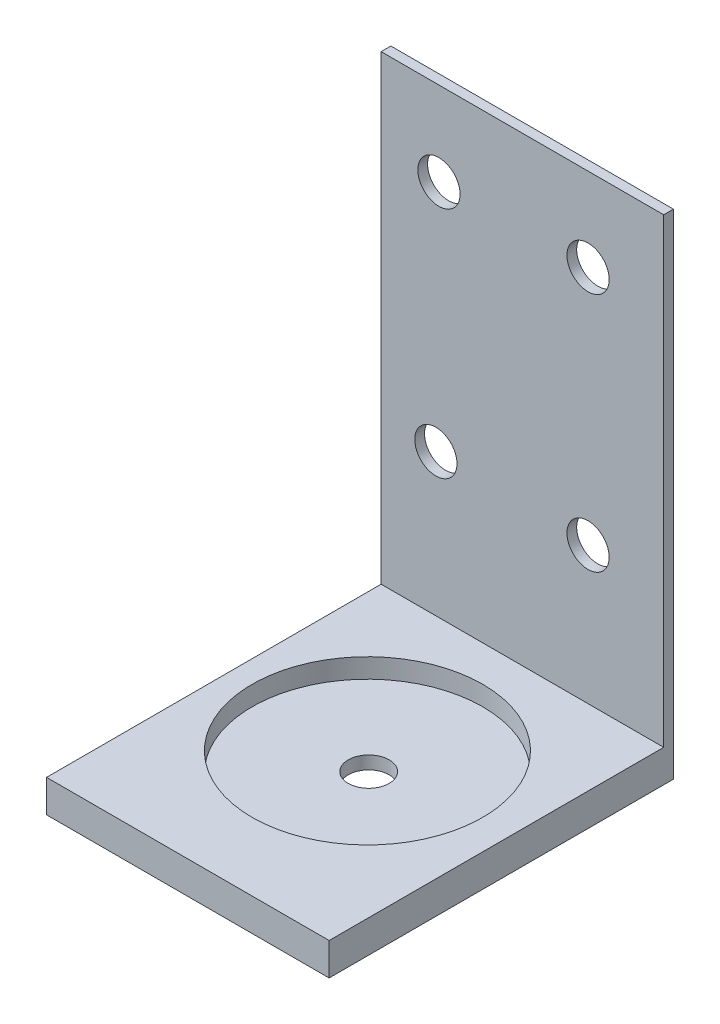
ISO-10303-21;
HEADER;
FILE_DESCRIPTION(('STEP AP214'),'2;1');
FILE_NAME('part.step','',(''),(''),'','','');
FILE_SCHEMA(('AUTOMOTIVE_DESIGN { 1 0 10303 214 1 1 1 1 }'));
ENDSEC;
DATA;
#1=APPLICATION_CONTEXT('core data for automotive mechanical design processes');
#2=APPLICATION_PROTOCOL_DEFINITION('international standard','automotive_design',2000,#1);
#3=PRODUCT_CONTEXT('',#1,'mechanical');
#4=PRODUCT('Part','Part','',(#3));
#5=PRODUCT_RELATED_PRODUCT_CATEGORY('part','',(#4));
#6=PRODUCT_DEFINITION_FORMATION('','',#4);
#7=PRODUCT_DEFINITION_CONTEXT('part definition',#1,'design');
#8=PRODUCT_DEFINITION('design','',#6,#7);
#9=PRODUCT_DEFINITION_SHAPE('','',#8);
#10=(LENGTH_UNIT() NAMED_UNIT(*) SI_UNIT(.MILLI.,.METRE.));
#11=(NAMED_UNIT(*) PLANE_ANGLE_UNIT() SI_UNIT($,.RADIAN.));
#12=(NAMED_UNIT(*) SI_UNIT($,.STERADIAN.) SOLID_ANGLE_UNIT());
#13=UNCERTAINTY_MEASURE_WITH_UNIT(LENGTH_MEASURE(1.E-05),#10,'distance_accuracy_value','');
#14=(GEOMETRIC_REPRESENTATION_CONTEXT(3) GLOBAL_UNCERTAINTY_ASSIGNED_CONTEXT((#13)) GLOBAL_UNIT_ASSIGNED_CONTEXT((#10,
#11,#12)) REPRESENTATION_CONTEXT('',''));
#15=CARTESIAN_POINT('',(0.,0.,0.));
#16=DIRECTION('',(0.,0.,1.));
#17=DIRECTION('',(1.,0.,0.));
#18=AXIS2_PLACEMENT_3D('',#15,#16,#17);
#19=CARTESIAN_POINT('',(0.,2.54,0.));
#20=DIRECTION('',(0.,-1.,0.));
#21=DIRECTION('',(0.,0.,-1.));
#22=AXIS2_PLACEMENT_3D('',#19,#20,#21);
#23=PLANE('',#22);
#24=CARTESIAN_POINT('',(-1.94128650310432,2.54,-7.50030305193306));
#25=DIRECTION('',(0.,1.,0.));
#26=DIRECTION('',(0.,0.,1.));
#27=AXIS2_PLACEMENT_3D('',#24,#25,#26);
#28=CIRCLE('',#27,9.017);
#29=CARTESIAN_POINT('',(-1.94128650310432,2.54,1.51669694806694));
#30=VERTEX_POINT('',#29);
#31=EDGE_CURVE('E329',#30,#30,#28,.T.);
#32=ORIENTED_EDGE('',*,*,#31,.F.);
#33=EDGE_LOOP('',(#32));
#34=FACE_BOUND('',#33,.T.);
#35=DIRECTION('',(1.,0.,0.));
#36=VECTOR('',#35,1.);
#37=CARTESIAN_POINT('',(-12.6914189189189,2.54,-19.3203040540541));
#38=LINE('',#37,#36);
#39=CARTESIAN_POINT('',(-12.6914189189189,2.54,-19.3203040540541));
#40=VERTEX_POINT('',#39);
#41=CARTESIAN_POINT('',(9.40658108108106,2.54,-19.3203040540541));
#42=VERTEX_POINT('',#41);
#43=EDGE_CURVE('E62',#40,#42,#38,.T.);
#44=ORIENTED_EDGE('',*,*,#43,.F.);
#45=DIRECTION('',(0.,0.,1.));
#46=VECTOR('',#45,1.);
#47=CARTESIAN_POINT('',(-12.6914189189189,2.54,6.84169594594594));
#48=LINE('',#47,#46);
#49=CARTESIAN_POINT('',(-12.6914189189189,2.54,6.84169594594594));
#50=VERTEX_POINT('',#49);
#51=EDGE_CURVE('E99',#40,#50,#48,.T.);
#52=ORIENTED_EDGE('',*,*,#51,.T.);
#53=DIRECTION('',(1.,0.,0.));
#54=VECTOR('',#53,1.);
#55=CARTESIAN_POINT('',(-12.6914189189189,2.54,6.84169594594594));
#56=LINE('',#55,#54);
#57=CARTESIAN_POINT('',(9.40658108108106,2.54,6.84169594594594));
#58=VERTEX_POINT('',#57);
#59=EDGE_CURVE('E70',#50,#58,#56,.T.);
#60=ORIENTED_EDGE('',*,*,#59,.T.);
#61=DIRECTION('',(0.,0.,-1.));
#62=VECTOR('',#61,1.);
#63=CARTESIAN_POINT('',(9.40658108108106,2.54,6.84169594594594));
#64=LINE('',#63,#62);
#65=EDGE_CURVE('E115',#58,#42,#64,.T.);
#66=ORIENTED_EDGE('',*,*,#65,.T.);
#67=EDGE_LOOP('',(#44,#52,#60,#66));
#68=FACE_BOUND('',#67,.T.);
#69=ADVANCED_FACE('F44',(#34,#68),#23,.F.);
#70=CARTESIAN_POINT('',(-12.6914189189189,2.54,6.84169594594594));
#71=DIRECTION('',(1.,0.,0.));
#72=DIRECTION('',(0.,0.,-1.));
#73=AXIS2_PLACEMENT_3D('',#70,#71,#72);
#74=PLANE('',#73);
#75=DIRECTION('',(0.,0.,1.));
#76=VECTOR('',#75,1.);
#77=CARTESIAN_POINT('',(-12.6914189189189,0.,6.84169594594594));
#78=LINE('',#77,#76);
#79=CARTESIAN_POINT('',(-12.6914189189189,0.,-20.0823040540541));
#80=VERTEX_POINT('',#79);
#81=CARTESIAN_POINT('',(-12.6914189189189,0.,6.84169594594594));
#82=VERTEX_POINT('',#81);
#83=EDGE_CURVE('E110',#80,#82,#78,.T.);
#84=ORIENTED_EDGE('',*,*,#83,.T.);
#85=DIRECTION('',(0.,-1.,0.));
#86=VECTOR('',#85,1.);
#87=CARTESIAN_POINT('',(-12.6914189189189,2.54,6.84169594594594));
#88=LINE('',#87,#86);
#89=EDGE_CURVE('E11',#50,#82,#88,.T.);
#90=ORIENTED_EDGE('',*,*,#89,.F.);
#91=ORIENTED_EDGE('',*,*,#51,.F.);
#92=DIRECTION('',(0.,-1.,0.));
#93=VECTOR('',#92,1.);
#94=CARTESIAN_POINT('',(-12.6914189189189,38.608,-19.3203040540541));
#95=LINE('',#94,#93);
#96=CARTESIAN_POINT('',(-12.6914189189189,38.608,-19.3203040540541));
#97=VERTEX_POINT('',#96);
#98=EDGE_CURVE('E117',#97,#40,#95,.T.);
#99=ORIENTED_EDGE('',*,*,#98,.F.);
#100=DIRECTION('',(0.,0.,1.));
#101=VECTOR('',#100,1.);
#102=CARTESIAN_POINT('',(-12.6914189189189,38.608,-20.0823040540541));
#103=LINE('',#102,#101);
#104=CARTESIAN_POINT('',(-12.6914189189189,38.608,-20.0823040540541));
#105=VERTEX_POINT('',#104);
#106=EDGE_CURVE('E109',#105,#97,#103,.T.);
#107=ORIENTED_EDGE('',*,*,#106,.F.);
#108=DIRECTION('',(0.,-1.,0.));
#109=VECTOR('',#108,1.);
#110=CARTESIAN_POINT('',(-12.6914189189189,2.54,-20.0823040540541));
#111=LINE('',#110,#109);
#112=EDGE_CURVE('E95',#105,#80,#111,.T.);
#113=ORIENTED_EDGE('',*,*,#112,.T.);
#114=EDGE_LOOP('',(#84,#90,#91,#99,#107,#113));
#115=FACE_BOUND('',#114,.T.);
#116=ADVANCED_FACE('F50',(#115),#74,.F.);
#117=CARTESIAN_POINT('',(-12.6914189189189,2.54,6.84169594594594));
#118=DIRECTION('',(0.,0.,-1.));
#119=DIRECTION('',(-1.,0.,0.));
#120=AXIS2_PLACEMENT_3D('',#117,#118,#119);
#121=PLANE('',#120);
#122=DIRECTION('',(1.,0.,0.));
#123=VECTOR('',#122,1.);
#124=CARTESIAN_POINT('',(-12.6914189189189,0.,6.84169594594594));
#125=LINE('',#124,#123);
#126=CARTESIAN_POINT('',(9.40658108108106,0.,6.84169594594594));
#127=VERTEX_POINT('',#126);
#128=EDGE_CURVE('E113',#82,#127,#125,.T.);
#129=ORIENTED_EDGE('',*,*,#128,.T.);
#130=DIRECTION('',(0.,-1.,0.));
#131=VECTOR('',#130,1.);
#132=CARTESIAN_POINT('',(9.40658108108106,2.54,6.84169594594594));
#133=LINE('',#132,#131);
#134=EDGE_CURVE('E54',#58,#127,#133,.T.);
#135=ORIENTED_EDGE('',*,*,#134,.F.);
#136=ORIENTED_EDGE('',*,*,#59,.F.);
#137=ORIENTED_EDGE('',*,*,#89,.T.);
#138=EDGE_LOOP('',(#129,#135,#136,#137));
#139=FACE_BOUND('',#138,.T.);
#140=ADVANCED_FACE('F136',(#139),#121,.F.);
#141=CARTESIAN_POINT('',(9.40658108108106,2.54,6.84169594594594));
#142=DIRECTION('',(-1.,0.,0.));
#143=DIRECTION('',(0.,0.,1.));
#144=AXIS2_PLACEMENT_3D('',#141,#142,#143);
#145=PLANE('',#144);
#146=DIRECTION('',(0.,0.,-1.));
#147=VECTOR('',#146,1.);
#148=CARTESIAN_POINT('',(9.40658108108106,0.,6.84169594594594));
#149=LINE('',#148,#147);
#150=CARTESIAN_POINT('',(9.40658108108106,0.,-20.0823040540541));
#151=VERTEX_POINT('',#150);
#152=EDGE_CURVE('E101',#127,#151,#149,.T.);
#153=ORIENTED_EDGE('',*,*,#152,.T.);
#154=DIRECTION('',(0.,-1.,0.));
#155=VECTOR('',#154,1.);
#156=CARTESIAN_POINT('',(9.40658108108106,2.54,-20.0823040540541));
#157=LINE('',#156,#155);
#158=CARTESIAN_POINT('',(9.40658108108106,38.608,-20.0823040540541));
#159=VERTEX_POINT('',#158);
#160=EDGE_CURVE('E92',#159,#151,#157,.T.);
#161=ORIENTED_EDGE('',*,*,#160,.F.);
#162=DIRECTION('',(0.,0.,-1.));
#163=VECTOR('',#162,1.);
#164=CARTESIAN_POINT('',(9.40658108108106,38.608,-20.0823040540541));
#165=LINE('',#164,#163);
#166=CARTESIAN_POINT('',(9.40658108108106,38.608,-19.3203040540541));
#167=VERTEX_POINT('',#166);
#168=EDGE_CURVE('E156',#167,#159,#165,.T.);
#169=ORIENTED_EDGE('',*,*,#168,.F.);
#170=DIRECTION('',(0.,-1.,0.));
#171=VECTOR('',#170,1.);
#172=CARTESIAN_POINT('',(9.40658108108106,38.608,-19.3203040540541));
#173=LINE('',#172,#171);
#174=EDGE_CURVE('E125',#167,#42,#173,.T.);
#175=ORIENTED_EDGE('',*,*,#174,.T.);
#176=ORIENTED_EDGE('',*,*,#65,.F.);
#177=ORIENTED_EDGE('',*,*,#134,.T.);
#178=EDGE_LOOP('',(#153,#161,#169,#175,#176,#177));
#179=FACE_BOUND('',#178,.T.);
#180=ADVANCED_FACE('F137',(#179),#145,.F.);
#181=CARTESIAN_POINT('',(-12.6914189189189,2.54,-20.0823040540541));
#182=DIRECTION('',(0.,0.,1.));
#183=DIRECTION('',(1.,0.,0.));
#184=AXIS2_PLACEMENT_3D('',#181,#182,#183);
#185=PLANE('',#184);
#186=CARTESIAN_POINT('',(3.49179403615205,32.0875383009741,-20.0823040540541));
#187=DIRECTION('',(0.,0.,1.));
#188=DIRECTION('',(1.,0.,0.));
#189=AXIS2_PLACEMENT_3D('',#186,#187,#188);
#190=CIRCLE('',#189,1.651);
#191=CARTESIAN_POINT('',(5.14279403615205,32.0875383009741,-20.0823040540541));
#192=VERTEX_POINT('',#191);
#193=EDGE_CURVE('E296',#192,#192,#190,.T.);
#194=ORIENTED_EDGE('',*,*,#193,.T.);
#195=EDGE_LOOP('',(#194));
#196=FACE_BOUND('',#195,.T.);
#197=CARTESIAN_POINT('',(-8.40806402793771,13.6619516210932,-20.0823040540541));
#198=DIRECTION('',(0.,0.,1.));
#199=DIRECTION('',(1.,0.,0.));
#200=AXIS2_PLACEMENT_3D('',#197,#198,#199);
#201=CIRCLE('',#200,1.651);
#202=CARTESIAN_POINT('',(-6.75706402793771,13.6619516210932,-20.0823040540541));
#203=VERTEX_POINT('',#202);
#204=EDGE_CURVE('E310',#203,#203,#201,.T.);
#205=ORIENTED_EDGE('',*,*,#204,.T.);
#206=EDGE_LOOP('',(#205));
#207=FACE_BOUND('',#206,.T.);
#208=CARTESIAN_POINT('',(3.49179403615205,13.278085231929,-20.0823040540541));
#209=DIRECTION('',(0.,0.,1.));
#210=DIRECTION('',(1.,0.,0.));
#211=AXIS2_PLACEMENT_3D('',#208,#209,#210);
#212=CIRCLE('',#211,1.651);
#213=CARTESIAN_POINT('',(5.14279403615205,13.278085231929,-20.0823040540541));
#214=VERTEX_POINT('',#213);
#215=EDGE_CURVE('E317',#214,#214,#212,.T.);
#216=ORIENTED_EDGE('',*,*,#215,.T.);
#217=EDGE_LOOP('',(#216));
#218=FACE_BOUND('',#217,.T.);
#219=CARTESIAN_POINT('',(-8.1681475347101,32.0395550023286,-20.0823040540541));
#220=DIRECTION('',(0.,0.,1.));
#221=DIRECTION('',(1.,0.,0.));
#222=AXIS2_PLACEMENT_3D('',#219,#220,#221);
#223=CIRCLE('',#222,1.651);
#224=CARTESIAN_POINT('',(-6.5171475347101,32.0395550023286,-20.0823040540541));
#225=VERTEX_POINT('',#224);
#226=EDGE_CURVE('E162',#225,#225,#223,.T.);
#227=ORIENTED_EDGE('',*,*,#226,.T.);
#228=EDGE_LOOP('',(#227));
#229=FACE_BOUND('',#228,.T.);
#230=DIRECTION('',(-1.,0.,0.));
#231=VECTOR('',#230,1.);
#232=CARTESIAN_POINT('',(-12.6914189189189,0.,-20.0823040540541));
#233=LINE('',#232,#231);
#234=EDGE_CURVE('E86',#151,#80,#233,.T.);
#235=ORIENTED_EDGE('',*,*,#234,.T.);
#236=ORIENTED_EDGE('',*,*,#112,.F.);
#237=DIRECTION('',(-1.,0.,0.));
#238=VECTOR('',#237,1.);
#239=CARTESIAN_POINT('',(-12.6914189189189,38.608,-20.0823040540541));
#240=LINE('',#239,#238);
#241=EDGE_CURVE('E157',#159,#105,#240,.T.);
#242=ORIENTED_EDGE('',*,*,#241,.F.);
#243=ORIENTED_EDGE('',*,*,#160,.T.);
#244=EDGE_LOOP('',(#235,#236,#242,#243));
#245=FACE_BOUND('',#244,.T.);
#246=ADVANCED_FACE('F89',(#196,#207,#218,#229,#245),#185,.F.);
#247=CARTESIAN_POINT('',(0.,0.,0.));
#248=DIRECTION('',(0.,-1.,0.));
#249=DIRECTION('',(0.,0.,-1.));
#250=AXIS2_PLACEMENT_3D('',#247,#248,#249);
#251=PLANE('',#250);
#252=CARTESIAN_POINT('',(-2.00770152181218,0.,-7.66634059870276));
#253=DIRECTION('',(0.,-1.,0.));
#254=DIRECTION('',(0.,0.,-1.));
#255=AXIS2_PLACEMENT_3D('',#252,#253,#254);
#256=CIRCLE('',#255,1.59948545844595);
#257=CARTESIAN_POINT('',(-2.00770152181218,0.,-9.26582605714871));
#258=VERTEX_POINT('',#257);
#259=EDGE_CURVE('E47',#258,#258,#256,.T.);
#260=ORIENTED_EDGE('',*,*,#259,.F.);
#261=EDGE_LOOP('',(#260));
#262=FACE_BOUND('',#261,.T.);
#263=ORIENTED_EDGE('',*,*,#83,.F.);
#264=ORIENTED_EDGE('',*,*,#234,.F.);
#265=ORIENTED_EDGE('',*,*,#152,.F.);
#266=ORIENTED_EDGE('',*,*,#128,.F.);
#267=EDGE_LOOP('',(#263,#264,#265,#266));
#268=FACE_BOUND('',#267,.T.);
#269=ADVANCED_FACE('F111',(#262,#268),#251,.T.);
#270=CARTESIAN_POINT('',(-12.6914189189189,38.608,-19.3203040540541));
#271=DIRECTION('',(0.,0.,-1.));
#272=DIRECTION('',(-1.,0.,0.));
#273=AXIS2_PLACEMENT_3D('',#270,#271,#272);
#274=PLANE('',#273);
#275=CARTESIAN_POINT('',(3.49179403615205,32.0875383009741,-19.3203040540541));
#276=DIRECTION('',(0.,0.,1.));
#277=DIRECTION('',(1.,0.,0.));
#278=AXIS2_PLACEMENT_3D('',#275,#276,#277);
#279=CIRCLE('',#278,1.651);
#280=CARTESIAN_POINT('',(5.14279403615205,32.0875383009741,-19.3203040540541));
#281=VERTEX_POINT('',#280);
#282=EDGE_CURVE('E298',#281,#281,#279,.T.);
#283=ORIENTED_EDGE('',*,*,#282,.F.);
#284=EDGE_LOOP('',(#283));
#285=FACE_BOUND('',#284,.T.);
#286=CARTESIAN_POINT('',(-8.40806402793771,13.6619516210932,-19.3203040540541));
#287=DIRECTION('',(0.,0.,1.));
#288=DIRECTION('',(1.,0.,0.));
#289=AXIS2_PLACEMENT_3D('',#286,#287,#288);
#290=CIRCLE('',#289,1.651);
#291=CARTESIAN_POINT('',(-6.75706402793771,13.6619516210932,-19.3203040540541));
#292=VERTEX_POINT('',#291);
#293=EDGE_CURVE('E304',#292,#292,#290,.T.);
#294=ORIENTED_EDGE('',*,*,#293,.F.);
#295=EDGE_LOOP('',(#294));
#296=FACE_BOUND('',#295,.T.);
#297=CARTESIAN_POINT('',(3.49179403615205,13.278085231929,-19.3203040540541));
#298=DIRECTION('',(0.,0.,1.));
#299=DIRECTION('',(1.,0.,0.));
#300=AXIS2_PLACEMENT_3D('',#297,#298,#299);
#301=CIRCLE('',#300,1.651);
#302=CARTESIAN_POINT('',(5.14279403615205,13.278085231929,-19.3203040540541));
#303=VERTEX_POINT('',#302);
#304=EDGE_CURVE('E312',#303,#303,#301,.T.);
#305=ORIENTED_EDGE('',*,*,#304,.F.);
#306=EDGE_LOOP('',(#305));
#307=FACE_BOUND('',#306,.T.);
#308=CARTESIAN_POINT('',(-8.1681475347101,32.0395550023286,-19.3203040540541));
#309=DIRECTION('',(0.,0.,1.));
#310=DIRECTION('',(1.,0.,0.));
#311=AXIS2_PLACEMENT_3D('',#308,#309,#310);
#312=CIRCLE('',#311,1.651);
#313=CARTESIAN_POINT('',(-6.5171475347101,32.0395550023286,-19.3203040540541));
#314=VERTEX_POINT('',#313);
#315=EDGE_CURVE('E167',#314,#314,#312,.T.);
#316=ORIENTED_EDGE('',*,*,#315,.F.);
#317=EDGE_LOOP('',(#316));
#318=FACE_BOUND('',#317,.T.);
#319=ORIENTED_EDGE('',*,*,#43,.T.);
#320=ORIENTED_EDGE('',*,*,#174,.F.);
#321=DIRECTION('',(1.,0.,0.));
#322=VECTOR('',#321,1.);
#323=CARTESIAN_POINT('',(-12.6914189189189,38.608,-19.3203040540541));
#324=LINE('',#323,#322);
#325=EDGE_CURVE('E149',#97,#167,#324,.T.);
#326=ORIENTED_EDGE('',*,*,#325,.F.);
#327=ORIENTED_EDGE('',*,*,#98,.T.);
#328=EDGE_LOOP('',(#319,#320,#326,#327));
#329=FACE_BOUND('',#328,.T.);
#330=ADVANCED_FACE('F144',(#285,#296,#307,#318,#329),#274,.F.);
#331=CARTESIAN_POINT('',(0.,38.608,0.));
#332=DIRECTION('',(0.,1.,0.));
#333=DIRECTION('',(0.,0.,1.));
#334=AXIS2_PLACEMENT_3D('',#331,#332,#333);
#335=PLANE('',#334);
#336=ORIENTED_EDGE('',*,*,#106,.T.);
#337=ORIENTED_EDGE('',*,*,#325,.T.);
#338=ORIENTED_EDGE('',*,*,#168,.T.);
#339=ORIENTED_EDGE('',*,*,#241,.T.);
#340=EDGE_LOOP('',(#336,#337,#338,#339));
#341=FACE_BOUND('',#340,.T.);
#342=ADVANCED_FACE('F158',(#341),#335,.T.);
#343=CARTESIAN_POINT('',(-8.1681475347101,32.0395550023286,-20.0823040540541));
#344=DIRECTION('',(0.,0.,1.));
#345=DIRECTION('',(1.,0.,0.));
#346=AXIS2_PLACEMENT_3D('',#343,#344,#345);
#347=CYLINDRICAL_SURFACE('',#346,1.651);
#348=CARTESIAN_POINT('',(-6.5171475347101,32.0395550023286,-20.0823040540541));
#349=CARTESIAN_POINT('',(-6.5171475347101,32.0395550023286,-20.0743665540541));
#350=CARTESIAN_POINT('',(-6.5171475347101,32.0395550023286,-20.0664290540541));
#351=CARTESIAN_POINT('',(-6.5171475347101,32.0395550023286,-20.0505540540541));
#352=CARTESIAN_POINT('',(-6.5171475347101,32.0395550023286,-20.0426165540541));
#353=CARTESIAN_POINT('',(-6.5171475347101,32.0395550023286,-20.0267415540541));
#354=CARTESIAN_POINT('',(-6.5171475347101,32.0395550023286,-20.0188040540541));
#355=CARTESIAN_POINT('',(-6.5171475347101,32.0395550023286,-20.0029290540541));
#356=CARTESIAN_POINT('',(-6.5171475347101,32.0395550023286,-19.9949915540541));
#357=CARTESIAN_POINT('',(-6.5171475347101,32.0395550023286,-19.9791165540541));
#358=CARTESIAN_POINT('',(-6.5171475347101,32.0395550023286,-19.9711790540541));
#359=CARTESIAN_POINT('',(-6.5171475347101,32.0395550023286,-19.9553040540541));
#360=CARTESIAN_POINT('',(-6.5171475347101,32.0395550023286,-19.9473665540541));
#361=CARTESIAN_POINT('',(-6.5171475347101,32.0395550023286,-19.9314915540541));
#362=CARTESIAN_POINT('',(-6.5171475347101,32.0395550023286,-19.9235540540541));
#363=CARTESIAN_POINT('',(-6.5171475347101,32.0395550023286,-19.9076790540541));
#364=CARTESIAN_POINT('',(-6.5171475347101,32.0395550023286,-19.8997415540541));
#365=CARTESIAN_POINT('',(-6.5171475347101,32.0395550023286,-19.8838665540541));
#366=CARTESIAN_POINT('',(-6.5171475347101,32.0395550023286,-19.8759290540541));
#367=CARTESIAN_POINT('',(-6.5171475347101,32.0395550023286,-19.8600540540541));
#368=CARTESIAN_POINT('',(-6.5171475347101,32.0395550023286,-19.8521165540541));
#369=CARTESIAN_POINT('',(-6.5171475347101,32.0395550023286,-19.8362415540541));
#370=CARTESIAN_POINT('',(-6.5171475347101,32.0395550023286,-19.8283040540541));
#371=CARTESIAN_POINT('',(-6.5171475347101,32.0395550023286,-19.8124290540541));
#372=CARTESIAN_POINT('',(-6.5171475347101,32.0395550023286,-19.8044915540541));
#373=CARTESIAN_POINT('',(-6.5171475347101,32.0395550023286,-19.7886165540541));
#374=CARTESIAN_POINT('',(-6.5171475347101,32.0395550023286,-19.7806790540541));
#375=CARTESIAN_POINT('',(-6.5171475347101,32.0395550023286,-19.7648040540541));
#376=CARTESIAN_POINT('',(-6.5171475347101,32.0395550023286,-19.7568665540541));
#377=CARTESIAN_POINT('',(-6.5171475347101,32.0395550023286,-19.7409915540541));
#378=CARTESIAN_POINT('',(-6.5171475347101,32.0395550023286,-19.7330540540541));
#379=CARTESIAN_POINT('',(-6.5171475347101,32.0395550023286,-19.7171790540541));
#380=CARTESIAN_POINT('',(-6.5171475347101,32.0395550023286,-19.7092415540541));
#381=CARTESIAN_POINT('',(-6.5171475347101,32.0395550023286,-19.6933665540541));
#382=CARTESIAN_POINT('',(-6.5171475347101,32.0395550023286,-19.6854290540541));
#383=CARTESIAN_POINT('',(-6.5171475347101,32.0395550023286,-19.6695540540541));
#384=CARTESIAN_POINT('',(-6.5171475347101,32.0395550023286,-19.6616165540541));
#385=CARTESIAN_POINT('',(-6.5171475347101,32.0395550023286,-19.6457415540541));
#386=CARTESIAN_POINT('',(-6.5171475347101,32.0395550023286,-19.6378040540541));
#387=CARTESIAN_POINT('',(-6.5171475347101,32.0395550023286,-19.6219290540541));
#388=CARTESIAN_POINT('',(-6.5171475347101,32.0395550023286,-19.6139915540541));
#389=CARTESIAN_POINT('',(-6.5171475347101,32.0395550023286,-19.5981165540541));
#390=CARTESIAN_POINT('',(-6.5171475347101,32.0395550023286,-19.5901790540541));
#391=CARTESIAN_POINT('',(-6.5171475347101,32.0395550023286,-19.5743040540541));
#392=CARTESIAN_POINT('',(-6.5171475347101,32.0395550023286,-19.5663665540541));
#393=CARTESIAN_POINT('',(-6.5171475347101,32.0395550023286,-19.5504915540541));
#394=CARTESIAN_POINT('',(-6.5171475347101,32.0395550023286,-19.5425540540541));
#395=CARTESIAN_POINT('',(-6.5171475347101,32.0395550023286,-19.5266790540541));
#396=CARTESIAN_POINT('',(-6.5171475347101,32.0395550023286,-19.5187415540541));
#397=CARTESIAN_POINT('',(-6.5171475347101,32.0395550023286,-19.5028665540541));
#398=CARTESIAN_POINT('',(-6.5171475347101,32.0395550023286,-19.4949290540541));
#399=CARTESIAN_POINT('',(-6.5171475347101,32.0395550023286,-19.4790540540541));
#400=CARTESIAN_POINT('',(-6.5171475347101,32.0395550023286,-19.4711165540541));
#401=CARTESIAN_POINT('',(-6.5171475347101,32.0395550023286,-19.4552415540541));
#402=CARTESIAN_POINT('',(-6.5171475347101,32.0395550023286,-19.4473040540541));
#403=CARTESIAN_POINT('',(-6.5171475347101,32.0395550023286,-19.4314290540541));
#404=CARTESIAN_POINT('',(-6.5171475347101,32.0395550023286,-19.4234915540541));
#405=CARTESIAN_POINT('',(-6.5171475347101,32.0395550023286,-19.4076165540541));
#406=CARTESIAN_POINT('',(-6.5171475347101,32.0395550023286,-19.3996790540541));
#407=CARTESIAN_POINT('',(-6.5171475347101,32.0395550023286,-19.3838040540541));
#408=CARTESIAN_POINT('',(-6.5171475347101,32.0395550023286,-19.3758665540541));
#409=CARTESIAN_POINT('',(-6.5171475347101,32.0395550023286,-19.3599915540541));
#410=CARTESIAN_POINT('',(-6.5171475347101,32.0395550023286,-19.3520540540541));
#411=CARTESIAN_POINT('',(-6.5171475347101,32.0395550023286,-19.3361790540541));
#412=CARTESIAN_POINT('',(-6.5171475347101,32.0395550023286,-19.3282415540541));
#413=CARTESIAN_POINT('',(-6.5171475347101,32.0395550023286,-19.3203040540541));
#414=B_SPLINE_CURVE_WITH_KNOTS('',3,(#348,#349,#350,#351,#352,#353,#354,#355,#356,#357,#358,
#359,#360,#361,#362,#363,#364,#365,#366,#367,#368,#369,#370,#371,#372,#373,#374,#375,#376,#377,
#378,#379,#380,#381,#382,#383,#384,#385,#386,#387,#388,#389,#390,#391,#392,#393,#394,#395,#396,
#397,#398,#399,#400,#401,#402,#403,#404,#405,#406,#407,#408,#409,#410,#411,#412,#413),
.UNSPECIFIED.,.F.,.F.,(4,2,2,2,2,2,2,2,2,2,2,2,2,2,2,2,2,2,2,2,2,2,2,2,2,2,2,2,2,2,2,2,4),(0.,
0.0238125000000013,0.0476250000000025,0.0714375000000003,0.0952500000000016,0.119062500000003,
0.142875000000001,0.166687500000002,0.1905,0.214312500000001,0.238125000000002,0.2619375,
0.285750000000001,0.309562500000003,0.333375,0.357187500000002,0.380999999999999,
0.404812500000001,0.428625000000002,0.4524375,0.476250000000001,0.500062500000002,0.523875,
0.547687500000001,0.571499999999999,0.5953125,0.619125000000002,0.642937499999999,
0.666750000000001,0.690562500000002,0.714375,0.738187500000001,0.761999999999999),.UNSPECIFIED.);
#415=EDGE_CURVE('BSEAM219',#225,#314,#414,.T.);
#416=ORIENTED_EDGE('',*,*,#226,.F.);
#417=ORIENTED_EDGE('',*,*,#315,.T.);
#418=ORIENTED_EDGE('',*,*,#415,.T.);
#419=ORIENTED_EDGE('',*,*,#415,.F.);
#420=EDGE_LOOP('',(#416,#418,#417,#419));
#421=FACE_BOUND('',#420,.T.);
#422=ADVANCED_FACE('F219',(#421),#347,.F.);
#423=CARTESIAN_POINT('',(-1.94128650310432,1.016,-7.50030305193306));
#424=DIRECTION('',(0.,1.,0.));
#425=DIRECTION('',(0.,0.,1.));
#426=AXIS2_PLACEMENT_3D('',#423,#424,#425);
#427=CYLINDRICAL_SURFACE('',#426,9.017);
#428=CARTESIAN_POINT('',(-1.94128650310432,1.016,-7.50030305193306));
#429=DIRECTION('',(0.,1.,0.));
#430=DIRECTION('',(0.,0.,1.));
#431=AXIS2_PLACEMENT_3D('',#428,#429,#430);
#432=CIRCLE('',#431,9.017);
#433=CARTESIAN_POINT('',(-1.94128650310432,1.016,1.51669694806694));
#434=VERTEX_POINT('',#433);
#435=EDGE_CURVE('E326',#434,#434,#432,.T.);
#436=ORIENTED_EDGE('',*,*,#435,.F.);
#437=EDGE_LOOP('',(#436));
#438=FACE_BOUND('',#437,.T.);
#439=ORIENTED_EDGE('',*,*,#31,.T.);
#440=EDGE_LOOP('',(#439));
#441=FACE_BOUND('',#440,.T.);
#442=ADVANCED_FACE('F227',(#438,#441),#427,.F.);
#443=CARTESIAN_POINT('',(-1.94128650310432,1.016,-7.50030305193306));
#444=DIRECTION('',(0.,1.,0.));
#445=DIRECTION('',(0.,0.,1.));
#446=AXIS2_PLACEMENT_3D('',#443,#444,#445);
#447=PLANE('',#446);
#448=CARTESIAN_POINT('',(-2.00770152181218,1.016,-7.66634059870276));
#449=DIRECTION('',(0.,1.,0.));
#450=DIRECTION('',(0.,0.,1.));
#451=AXIS2_PLACEMENT_3D('',#448,#449,#450);
#452=CIRCLE('',#451,1.59948545844595);
#453=CARTESIAN_POINT('',(-2.00770152181218,1.016,-6.0668551402568));
#454=VERTEX_POINT('',#453);
#455=EDGE_CURVE('E308',#454,#454,#452,.T.);
#456=ORIENTED_EDGE('',*,*,#455,.F.);
#457=EDGE_LOOP('',(#456));
#458=FACE_BOUND('',#457,.T.);
#459=ORIENTED_EDGE('',*,*,#435,.T.);
#460=EDGE_LOOP('',(#459));
#461=FACE_BOUND('',#460,.T.);
#462=ADVANCED_FACE('F239',(#458,#461),#447,.T.);
#463=CARTESIAN_POINT('',(-2.00770152181218,-0.254000000000001,-7.66634059870276));
#464=DIRECTION('',(0.,1.,0.));
#465=DIRECTION('',(0.,0.,1.));
#466=AXIS2_PLACEMENT_3D('',#463,#464,#465);
#467=CYLINDRICAL_SURFACE('',#466,1.59948545844595);
#468=ORIENTED_EDGE('',*,*,#259,.T.);
#469=EDGE_LOOP('',(#468));
#470=FACE_BOUND('',#469,.T.);
#471=ORIENTED_EDGE('',*,*,#455,.T.);
#472=EDGE_LOOP('',(#471));
#473=FACE_BOUND('',#472,.T.);
#474=ADVANCED_FACE('F246',(#470,#473),#467,.F.);
#475=CARTESIAN_POINT('',(3.49179403615205,13.278085231929,-20.0823040540541));
#476=DIRECTION('',(0.,0.,1.));
#477=DIRECTION('',(1.,0.,0.));
#478=AXIS2_PLACEMENT_3D('',#475,#476,#477);
#479=CYLINDRICAL_SURFACE('',#478,1.651);
#480=CARTESIAN_POINT('',(5.14279403615205,13.278085231929,-20.0823040540541));
#481=CARTESIAN_POINT('',(5.14279403615205,13.278085231929,-20.0743665540541));
#482=CARTESIAN_POINT('',(5.14279403615205,13.278085231929,-20.0664290540541));
#483=CARTESIAN_POINT('',(5.14279403615205,13.278085231929,-20.0505540540541));
#484=CARTESIAN_POINT('',(5.14279403615205,13.278085231929,-20.0426165540541));
#485=CARTESIAN_POINT('',(5.14279403615205,13.278085231929,-20.0267415540541));
#486=CARTESIAN_POINT('',(5.14279403615205,13.278085231929,-20.0188040540541));
#487=CARTESIAN_POINT('',(5.14279403615205,13.278085231929,-20.0029290540541));
#488=CARTESIAN_POINT('',(5.14279403615205,13.278085231929,-19.9949915540541));
#489=CARTESIAN_POINT('',(5.14279403615205,13.278085231929,-19.9791165540541));
#490=CARTESIAN_POINT('',(5.14279403615205,13.278085231929,-19.9711790540541));
#491=CARTESIAN_POINT('',(5.14279403615205,13.278085231929,-19.9553040540541));
#492=CARTESIAN_POINT('',(5.14279403615205,13.278085231929,-19.9473665540541));
#493=CARTESIAN_POINT('',(5.14279403615205,13.278085231929,-19.9314915540541));
#494=CARTESIAN_POINT('',(5.14279403615205,13.278085231929,-19.9235540540541));
#495=CARTESIAN_POINT('',(5.14279403615205,13.278085231929,-19.9076790540541));
#496=CARTESIAN_POINT('',(5.14279403615205,13.278085231929,-19.8997415540541));
#497=CARTESIAN_POINT('',(5.14279403615205,13.278085231929,-19.8838665540541));
#498=CARTESIAN_POINT('',(5.14279403615205,13.278085231929,-19.8759290540541));
#499=CARTESIAN_POINT('',(5.14279403615205,13.278085231929,-19.8600540540541));
#500=CARTESIAN_POINT('',(5.14279403615205,13.278085231929,-19.8521165540541));
#501=CARTESIAN_POINT('',(5.14279403615205,13.278085231929,-19.8362415540541));
#502=CARTESIAN_POINT('',(5.14279403615205,13.278085231929,-19.8283040540541));
#503=CARTESIAN_POINT('',(5.14279403615205,13.278085231929,-19.8124290540541));
#504=CARTESIAN_POINT('',(5.14279403615205,13.278085231929,-19.8044915540541));
#505=CARTESIAN_POINT('',(5.14279403615205,13.278085231929,-19.7886165540541));
#506=CARTESIAN_POINT('',(5.14279403615205,13.278085231929,-19.7806790540541));
#507=CARTESIAN_POINT('',(5.14279403615205,13.278085231929,-19.7648040540541));
#508=CARTESIAN_POINT('',(5.14279403615205,13.278085231929,-19.7568665540541));
#509=CARTESIAN_POINT('',(5.14279403615205,13.278085231929,-19.7409915540541));
#510=CARTESIAN_POINT('',(5.14279403615205,13.278085231929,-19.7330540540541));
#511=CARTESIAN_POINT('',(5.14279403615205,13.278085231929,-19.7171790540541));
#512=CARTESIAN_POINT('',(5.14279403615205,13.278085231929,-19.7092415540541));
#513=CARTESIAN_POINT('',(5.14279403615205,13.278085231929,-19.6933665540541));
#514=CARTESIAN_POINT('',(5.14279403615205,13.278085231929,-19.6854290540541));
#515=CARTESIAN_POINT('',(5.14279403615205,13.278085231929,-19.6695540540541));
#516=CARTESIAN_POINT('',(5.14279403615205,13.278085231929,-19.6616165540541));
#517=CARTESIAN_POINT('',(5.14279403615205,13.278085231929,-19.6457415540541));
#518=CARTESIAN_POINT('',(5.14279403615205,13.278085231929,-19.6378040540541));
#519=CARTESIAN_POINT('',(5.14279403615205,13.278085231929,-19.6219290540541));
#520=CARTESIAN_POINT('',(5.14279403615205,13.278085231929,-19.6139915540541));
#521=CARTESIAN_POINT('',(5.14279403615205,13.278085231929,-19.5981165540541));
#522=CARTESIAN_POINT('',(5.14279403615205,13.278085231929,-19.5901790540541));
#523=CARTESIAN_POINT('',(5.14279403615205,13.278085231929,-19.5743040540541));
#524=CARTESIAN_POINT('',(5.14279403615205,13.278085231929,-19.5663665540541));
#525=CARTESIAN_POINT('',(5.14279403615205,13.278085231929,-19.5504915540541));
#526=CARTESIAN_POINT('',(5.14279403615205,13.278085231929,-19.5425540540541));
#527=CARTESIAN_POINT('',(5.14279403615205,13.278085231929,-19.5266790540541));
#528=CARTESIAN_POINT('',(5.14279403615205,13.278085231929,-19.5187415540541));
#529=CARTESIAN_POINT('',(5.14279403615205,13.278085231929,-19.5028665540541));
#530=CARTESIAN_POINT('',(5.14279403615205,13.278085231929,-19.4949290540541));
#531=CARTESIAN_POINT('',(5.14279403615205,13.278085231929,-19.4790540540541));
#532=CARTESIAN_POINT('',(5.14279403615205,13.278085231929,-19.4711165540541));
#533=CARTESIAN_POINT('',(5.14279403615205,13.278085231929,-19.4552415540541));
#534=CARTESIAN_POINT('',(5.14279403615205,13.278085231929,-19.4473040540541));
#535=CARTESIAN_POINT('',(5.14279403615205,13.278085231929,-19.4314290540541));
#536=CARTESIAN_POINT('',(5.14279403615205,13.278085231929,-19.4234915540541));
#537=CARTESIAN_POINT('',(5.14279403615205,13.278085231929,-19.4076165540541));
#538=CARTESIAN_POINT('',(5.14279403615205,13.278085231929,-19.3996790540541));
#539=CARTESIAN_POINT('',(5.14279403615205,13.278085231929,-19.3838040540541));
#540=CARTESIAN_POINT('',(5.14279403615205,13.278085231929,-19.3758665540541));
#541=CARTESIAN_POINT('',(5.14279403615205,13.278085231929,-19.3599915540541));
#542=CARTESIAN_POINT('',(5.14279403615205,13.278085231929,-19.3520540540541));
#543=CARTESIAN_POINT('',(5.14279403615205,13.278085231929,-19.3361790540541));
#544=CARTESIAN_POINT('',(5.14279403615205,13.278085231929,-19.3282415540541));
#545=CARTESIAN_POINT('',(5.14279403615205,13.278085231929,-19.3203040540541));
#546=B_SPLINE_CURVE_WITH_KNOTS('',3,(#480,#481,#482,#483,#484,#485,#486,#487,#488,#489,#490,
#491,#492,#493,#494,#495,#496,#497,#498,#499,#500,#501,#502,#503,#504,#505,#506,#507,#508,#509,
#510,#511,#512,#513,#514,#515,#516,#517,#518,#519,#520,#521,#522,#523,#524,#525,#526,#527,#528,
#529,#530,#531,#532,#533,#534,#535,#536,#537,#538,#539,#540,#541,#542,#543,#544,#545),
.UNSPECIFIED.,.F.,.F.,(4,2,2,2,2,2,2,2,2,2,2,2,2,2,2,2,2,2,2,2,2,2,2,2,2,2,2,2,2,2,2,2,4),(0.,
0.0238125000000013,0.0476250000000025,0.0714375000000003,0.0952500000000016,0.119062500000003,
0.142875000000001,0.166687500000002,0.1905,0.214312500000001,0.238125000000002,0.2619375,
0.285750000000001,0.309562500000003,0.333375,0.357187500000002,0.380999999999999,
0.404812500000001,0.428625000000002,0.4524375,0.476250000000001,0.500062500000002,0.523875,
0.547687500000001,0.571499999999999,0.5953125,0.619125000000002,0.642937499999999,
0.666750000000001,0.690562500000002,0.714375,0.738187500000001,0.761999999999999),.UNSPECIFIED.);
#547=EDGE_CURVE('BSEAM259',#214,#303,#546,.T.);
#548=ORIENTED_EDGE('',*,*,#215,.F.);
#549=ORIENTED_EDGE('',*,*,#304,.T.);
#550=ORIENTED_EDGE('',*,*,#547,.T.);
#551=ORIENTED_EDGE('',*,*,#547,.F.);
#552=EDGE_LOOP('',(#548,#550,#549,#551));
#553=FACE_BOUND('',#552,.T.);
#554=ADVANCED_FACE('F259',(#553),#479,.F.);
#555=CARTESIAN_POINT('',(-8.40806402793771,13.6619516210932,-20.0823040540541));
#556=DIRECTION('',(0.,0.,1.));
#557=DIRECTION('',(1.,0.,0.));
#558=AXIS2_PLACEMENT_3D('',#555,#556,#557);
#559=CYLINDRICAL_SURFACE('',#558,1.651);
#560=CARTESIAN_POINT('',(-6.75706402793771,13.6619516210932,-20.0823040540541));
#561=CARTESIAN_POINT('',(-6.75706402793771,13.6619516210932,-20.0743665540541));
#562=CARTESIAN_POINT('',(-6.75706402793771,13.6619516210932,-20.0664290540541));
#563=CARTESIAN_POINT('',(-6.75706402793771,13.6619516210932,-20.0505540540541));
#564=CARTESIAN_POINT('',(-6.75706402793771,13.6619516210932,-20.0426165540541));
#565=CARTESIAN_POINT('',(-6.75706402793771,13.6619516210932,-20.0267415540541));
#566=CARTESIAN_POINT('',(-6.75706402793771,13.6619516210932,-20.0188040540541));
#567=CARTESIAN_POINT('',(-6.75706402793771,13.6619516210932,-20.0029290540541));
#568=CARTESIAN_POINT('',(-6.75706402793771,13.6619516210932,-19.9949915540541));
#569=CARTESIAN_POINT('',(-6.75706402793771,13.6619516210932,-19.9791165540541));
#570=CARTESIAN_POINT('',(-6.75706402793771,13.6619516210932,-19.9711790540541));
#571=CARTESIAN_POINT('',(-6.75706402793771,13.6619516210932,-19.9553040540541));
#572=CARTESIAN_POINT('',(-6.75706402793771,13.6619516210932,-19.9473665540541));
#573=CARTESIAN_POINT('',(-6.75706402793771,13.6619516210932,-19.9314915540541));
#574=CARTESIAN_POINT('',(-6.75706402793771,13.6619516210932,-19.9235540540541));
#575=CARTESIAN_POINT('',(-6.75706402793771,13.6619516210932,-19.9076790540541));
#576=CARTESIAN_POINT('',(-6.75706402793771,13.6619516210932,-19.8997415540541));
#577=CARTESIAN_POINT('',(-6.75706402793771,13.6619516210932,-19.8838665540541));
#578=CARTESIAN_POINT('',(-6.75706402793771,13.6619516210932,-19.8759290540541));
#579=CARTESIAN_POINT('',(-6.75706402793771,13.6619516210932,-19.8600540540541));
#580=CARTESIAN_POINT('',(-6.75706402793771,13.6619516210932,-19.8521165540541));
#581=CARTESIAN_POINT('',(-6.75706402793771,13.6619516210932,-19.8362415540541));
#582=CARTESIAN_POINT('',(-6.75706402793771,13.6619516210932,-19.8283040540541));
#583=CARTESIAN_POINT('',(-6.75706402793771,13.6619516210932,-19.8124290540541));
#584=CARTESIAN_POINT('',(-6.75706402793771,13.6619516210932,-19.8044915540541));
#585=CARTESIAN_POINT('',(-6.75706402793771,13.6619516210932,-19.7886165540541));
#586=CARTESIAN_POINT('',(-6.75706402793771,13.6619516210932,-19.7806790540541));
#587=CARTESIAN_POINT('',(-6.75706402793771,13.6619516210932,-19.7648040540541));
#588=CARTESIAN_POINT('',(-6.75706402793771,13.6619516210932,-19.7568665540541));
#589=CARTESIAN_POINT('',(-6.75706402793771,13.6619516210932,-19.7409915540541));
#590=CARTESIAN_POINT('',(-6.75706402793771,13.6619516210932,-19.7330540540541));
#591=CARTESIAN_POINT('',(-6.75706402793771,13.6619516210932,-19.7171790540541));
#592=CARTESIAN_POINT('',(-6.75706402793771,13.6619516210932,-19.7092415540541));
#593=CARTESIAN_POINT('',(-6.75706402793771,13.6619516210932,-19.6933665540541));
#594=CARTESIAN_POINT('',(-6.75706402793771,13.6619516210932,-19.6854290540541));
#595=CARTESIAN_POINT('',(-6.75706402793771,13.6619516210932,-19.6695540540541));
#596=CARTESIAN_POINT('',(-6.75706402793771,13.6619516210932,-19.6616165540541));
#597=CARTESIAN_POINT('',(-6.75706402793771,13.6619516210932,-19.6457415540541));
#598=CARTESIAN_POINT('',(-6.75706402793771,13.6619516210932,-19.6378040540541));
#599=CARTESIAN_POINT('',(-6.75706402793771,13.6619516210932,-19.6219290540541));
#600=CARTESIAN_POINT('',(-6.75706402793771,13.6619516210932,-19.6139915540541));
#601=CARTESIAN_POINT('',(-6.75706402793771,13.6619516210932,-19.5981165540541));
#602=CARTESIAN_POINT('',(-6.75706402793771,13.6619516210932,-19.5901790540541));
#603=CARTESIAN_POINT('',(-6.75706402793771,13.6619516210932,-19.5743040540541));
#604=CARTESIAN_POINT('',(-6.75706402793771,13.6619516210932,-19.5663665540541));
#605=CARTESIAN_POINT('',(-6.75706402793771,13.6619516210932,-19.5504915540541));
#606=CARTESIAN_POINT('',(-6.75706402793771,13.6619516210932,-19.5425540540541));
#607=CARTESIAN_POINT('',(-6.75706402793771,13.6619516210932,-19.5266790540541));
#608=CARTESIAN_POINT('',(-6.75706402793771,13.6619516210932,-19.5187415540541));
#609=CARTESIAN_POINT('',(-6.75706402793771,13.6619516210932,-19.5028665540541));
#610=CARTESIAN_POINT('',(-6.75706402793771,13.6619516210932,-19.4949290540541));
#611=CARTESIAN_POINT('',(-6.75706402793771,13.6619516210932,-19.4790540540541));
#612=CARTESIAN_POINT('',(-6.75706402793771,13.6619516210932,-19.4711165540541));
#613=CARTESIAN_POINT('',(-6.75706402793771,13.6619516210932,-19.4552415540541));
#614=CARTESIAN_POINT('',(-6.75706402793771,13.6619516210932,-19.4473040540541));
#615=CARTESIAN_POINT('',(-6.75706402793771,13.6619516210932,-19.4314290540541));
#616=CARTESIAN_POINT('',(-6.75706402793771,13.6619516210932,-19.4234915540541));
#617=CARTESIAN_POINT('',(-6.75706402793771,13.6619516210932,-19.4076165540541));
#618=CARTESIAN_POINT('',(-6.75706402793771,13.6619516210932,-19.3996790540541));
#619=CARTESIAN_POINT('',(-6.75706402793771,13.6619516210932,-19.3838040540541));
#620=CARTESIAN_POINT('',(-6.75706402793771,13.6619516210932,-19.3758665540541));
#621=CARTESIAN_POINT('',(-6.75706402793771,13.6619516210932,-19.3599915540541));
#622=CARTESIAN_POINT('',(-6.75706402793771,13.6619516210932,-19.3520540540541));
#623=CARTESIAN_POINT('',(-6.75706402793771,13.6619516210932,-19.3361790540541));
#624=CARTESIAN_POINT('',(-6.75706402793771,13.6619516210932,-19.3282415540541));
#625=CARTESIAN_POINT('',(-6.75706402793771,13.6619516210932,-19.3203040540541));
#626=B_SPLINE_CURVE_WITH_KNOTS('',3,(#560,#561,#562,#563,#564,#565,#566,#567,#568,#569,#570,
#571,#572,#573,#574,#575,#576,#577,#578,#579,#580,#581,#582,#583,#584,#585,#586,#587,#588,#589,
#590,#591,#592,#593,#594,#595,#596,#597,#598,#599,#600,#601,#602,#603,#604,#605,#606,#607,#608,
#609,#610,#611,#612,#613,#614,#615,#616,#617,#618,#619,#620,#621,#622,#623,#624,#625),
.UNSPECIFIED.,.F.,.F.,(4,2,2,2,2,2,2,2,2,2,2,2,2,2,2,2,2,2,2,2,2,2,2,2,2,2,2,2,2,2,2,2,4),(0.,
0.0238125000000013,0.0476250000000025,0.0714375000000003,0.0952500000000016,0.119062500000003,
0.142875000000001,0.166687500000002,0.1905,0.214312500000001,0.238125000000002,0.2619375,
0.285750000000001,0.309562500000003,0.333375,0.357187500000002,0.380999999999999,
0.404812500000001,0.428625000000002,0.4524375,0.476250000000001,0.500062500000002,0.523875,
0.547687500000001,0.571499999999999,0.5953125,0.619125000000002,0.642937499999999,
0.666750000000001,0.690562500000002,0.714375,0.738187500000001,0.761999999999999),.UNSPECIFIED.);
#627=EDGE_CURVE('BSEAM267',#203,#292,#626,.T.);
#628=ORIENTED_EDGE('',*,*,#204,.F.);
#629=ORIENTED_EDGE('',*,*,#293,.T.);
#630=ORIENTED_EDGE('',*,*,#627,.T.);
#631=ORIENTED_EDGE('',*,*,#627,.F.);
#632=EDGE_LOOP('',(#628,#630,#629,#631));
#633=FACE_BOUND('',#632,.T.);
#634=ADVANCED_FACE('F267',(#633),#559,.F.);
#635=CARTESIAN_POINT('',(3.49179403615205,32.0875383009741,-20.0823040540541));
#636=DIRECTION('',(0.,0.,1.));
#637=DIRECTION('',(1.,0.,0.));
#638=AXIS2_PLACEMENT_3D('',#635,#636,#637);
#639=CYLINDRICAL_SURFACE('',#638,1.651);
#640=CARTESIAN_POINT('',(5.14279403615205,32.0875383009741,-20.0823040540541));
#641=CARTESIAN_POINT('',(5.14279403615205,32.0875383009741,-20.0743665540541));
#642=CARTESIAN_POINT('',(5.14279403615205,32.0875383009741,-20.0664290540541));
#643=CARTESIAN_POINT('',(5.14279403615205,32.0875383009741,-20.0505540540541));
#644=CARTESIAN_POINT('',(5.14279403615205,32.0875383009741,-20.0426165540541));
#645=CARTESIAN_POINT('',(5.14279403615205,32.0875383009741,-20.0267415540541));
#646=CARTESIAN_POINT('',(5.14279403615205,32.0875383009741,-20.0188040540541));
#647=CARTESIAN_POINT('',(5.14279403615205,32.0875383009741,-20.0029290540541));
#648=CARTESIAN_POINT('',(5.14279403615205,32.0875383009741,-19.9949915540541));
#649=CARTESIAN_POINT('',(5.14279403615205,32.0875383009741,-19.9791165540541));
#650=CARTESIAN_POINT('',(5.14279403615205,32.0875383009741,-19.9711790540541));
#651=CARTESIAN_POINT('',(5.14279403615205,32.0875383009741,-19.9553040540541));
#652=CARTESIAN_POINT('',(5.14279403615205,32.0875383009741,-19.9473665540541));
#653=CARTESIAN_POINT('',(5.14279403615205,32.0875383009741,-19.9314915540541));
#654=CARTESIAN_POINT('',(5.14279403615205,32.0875383009741,-19.9235540540541));
#655=CARTESIAN_POINT('',(5.14279403615205,32.0875383009741,-19.9076790540541));
#656=CARTESIAN_POINT('',(5.14279403615205,32.0875383009741,-19.8997415540541));
#657=CARTESIAN_POINT('',(5.14279403615205,32.0875383009741,-19.8838665540541));
#658=CARTESIAN_POINT('',(5.14279403615205,32.0875383009741,-19.8759290540541));
#659=CARTESIAN_POINT('',(5.14279403615205,32.0875383009741,-19.8600540540541));
#660=CARTESIAN_POINT('',(5.14279403615205,32.0875383009741,-19.8521165540541));
#661=CARTESIAN_POINT('',(5.14279403615205,32.0875383009741,-19.8362415540541));
#662=CARTESIAN_POINT('',(5.14279403615205,32.0875383009741,-19.8283040540541));
#663=CARTESIAN_POINT('',(5.14279403615205,32.0875383009741,-19.8124290540541));
#664=CARTESIAN_POINT('',(5.14279403615205,32.0875383009741,-19.8044915540541));
#665=CARTESIAN_POINT('',(5.14279403615205,32.0875383009741,-19.7886165540541));
#666=CARTESIAN_POINT('',(5.14279403615205,32.0875383009741,-19.7806790540541));
#667=CARTESIAN_POINT('',(5.14279403615205,32.0875383009741,-19.7648040540541));
#668=CARTESIAN_POINT('',(5.14279403615205,32.0875383009741,-19.7568665540541));
#669=CARTESIAN_POINT('',(5.14279403615205,32.0875383009741,-19.7409915540541));
#670=CARTESIAN_POINT('',(5.14279403615205,32.0875383009741,-19.7330540540541));
#671=CARTESIAN_POINT('',(5.14279403615205,32.0875383009741,-19.7171790540541));
#672=CARTESIAN_POINT('',(5.14279403615205,32.0875383009741,-19.7092415540541));
#673=CARTESIAN_POINT('',(5.14279403615205,32.0875383009741,-19.6933665540541));
#674=CARTESIAN_POINT('',(5.14279403615205,32.0875383009741,-19.6854290540541));
#675=CARTESIAN_POINT('',(5.14279403615205,32.0875383009741,-19.6695540540541));
#676=CARTESIAN_POINT('',(5.14279403615205,32.0875383009741,-19.6616165540541));
#677=CARTESIAN_POINT('',(5.14279403615205,32.0875383009741,-19.6457415540541));
#678=CARTESIAN_POINT('',(5.14279403615205,32.0875383009741,-19.6378040540541));
#679=CARTESIAN_POINT('',(5.14279403615205,32.0875383009741,-19.6219290540541));
#680=CARTESIAN_POINT('',(5.14279403615205,32.0875383009741,-19.6139915540541));
#681=CARTESIAN_POINT('',(5.14279403615205,32.0875383009741,-19.5981165540541));
#682=CARTESIAN_POINT('',(5.14279403615205,32.0875383009741,-19.5901790540541));
#683=CARTESIAN_POINT('',(5.14279403615205,32.0875383009741,-19.5743040540541));
#684=CARTESIAN_POINT('',(5.14279403615205,32.0875383009741,-19.5663665540541));
#685=CARTESIAN_POINT('',(5.14279403615205,32.0875383009741,-19.5504915540541));
#686=CARTESIAN_POINT('',(5.14279403615205,32.0875383009741,-19.5425540540541));
#687=CARTESIAN_POINT('',(5.14279403615205,32.0875383009741,-19.5266790540541));
#688=CARTESIAN_POINT('',(5.14279403615205,32.0875383009741,-19.5187415540541));
#689=CARTESIAN_POINT('',(5.14279403615205,32.0875383009741,-19.5028665540541));
#690=CARTESIAN_POINT('',(5.14279403615205,32.0875383009741,-19.4949290540541));
#691=CARTESIAN_POINT('',(5.14279403615205,32.0875383009741,-19.4790540540541));
#692=CARTESIAN_POINT('',(5.14279403615205,32.0875383009741,-19.4711165540541));
#693=CARTESIAN_POINT('',(5.14279403615205,32.0875383009741,-19.4552415540541));
#694=CARTESIAN_POINT('',(5.14279403615205,32.0875383009741,-19.4473040540541));
#695=CARTESIAN_POINT('',(5.14279403615205,32.0875383009741,-19.4314290540541));
#696=CARTESIAN_POINT('',(5.14279403615205,32.0875383009741,-19.4234915540541));
#697=CARTESIAN_POINT('',(5.14279403615205,32.0875383009741,-19.4076165540541));
#698=CARTESIAN_POINT('',(5.14279403615205,32.0875383009741,-19.3996790540541));
#699=CARTESIAN_POINT('',(5.14279403615205,32.0875383009741,-19.3838040540541));
#700=CARTESIAN_POINT('',(5.14279403615205,32.0875383009741,-19.3758665540541));
#701=CARTESIAN_POINT('',(5.14279403615205,32.0875383009741,-19.3599915540541));
#702=CARTESIAN_POINT('',(5.14279403615205,32.0875383009741,-19.3520540540541));
#703=CARTESIAN_POINT('',(5.14279403615205,32.0875383009741,-19.3361790540541));
#704=CARTESIAN_POINT('',(5.14279403615205,32.0875383009741,-19.3282415540541));
#705=CARTESIAN_POINT('',(5.14279403615205,32.0875383009741,-19.3203040540541));
#706=B_SPLINE_CURVE_WITH_KNOTS('',3,(#640,#641,#642,#643,#644,#645,#646,#647,#648,#649,#650,
#651,#652,#653,#654,#655,#656,#657,#658,#659,#660,#661,#662,#663,#664,#665,#666,#667,#668,#669,
#670,#671,#672,#673,#674,#675,#676,#677,#678,#679,#680,#681,#682,#683,#684,#685,#686,#687,#688,
#689,#690,#691,#692,#693,#694,#695,#696,#697,#698,#699,#700,#701,#702,#703,#704,#705),
.UNSPECIFIED.,.F.,.F.,(4,2,2,2,2,2,2,2,2,2,2,2,2,2,2,2,2,2,2,2,2,2,2,2,2,2,2,2,2,2,2,2,4),(0.,
0.0238125000000013,0.0476250000000025,0.0714375000000003,0.0952500000000016,0.119062500000003,
0.142875000000001,0.166687500000002,0.1905,0.214312500000001,0.238125000000002,0.2619375,
0.285750000000001,0.309562500000003,0.333375,0.357187500000002,0.380999999999999,
0.404812500000001,0.428625000000002,0.4524375,0.476250000000001,0.500062500000002,0.523875,
0.547687500000001,0.571499999999999,0.5953125,0.619125000000002,0.642937499999999,
0.666750000000001,0.690562500000002,0.714375,0.738187500000001,0.761999999999999),.UNSPECIFIED.);
#707=EDGE_CURVE('BSEAM278',#192,#281,#706,.T.);
#708=ORIENTED_EDGE('',*,*,#193,.F.);
#709=ORIENTED_EDGE('',*,*,#282,.T.);
#710=ORIENTED_EDGE('',*,*,#707,.T.);
#711=ORIENTED_EDGE('',*,*,#707,.F.);
#712=EDGE_LOOP('',(#708,#710,#709,#711));
#713=FACE_BOUND('',#712,.T.);
#714=ADVANCED_FACE('F278',(#713),#639,.F.);
#715=CLOSED_SHELL('',(#69,#116,#140,#180,#246,#269,#330,#342,#422,#442,#462,#474,#554,#634,#714));
#716=MANIFOLD_SOLID_BREP('B2',#715);
#717=ADVANCED_BREP_SHAPE_REPRESENTATION('',(#18,#716),#14);
#718=SHAPE_DEFINITION_REPRESENTATION(#9,#717);
ENDSEC;
END-ISO-10303-21;
